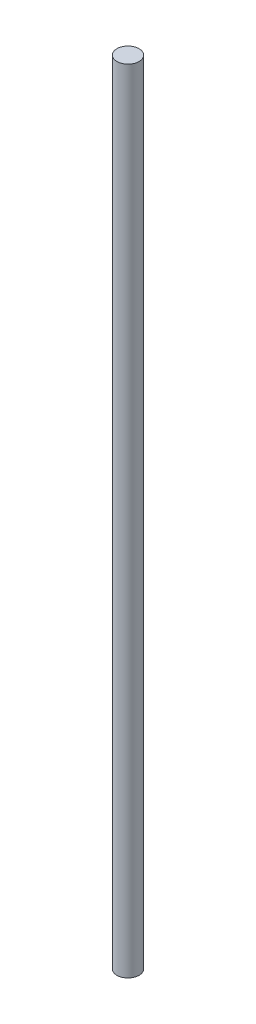
ISO-10303-21;
HEADER;
FILE_DESCRIPTION(('STEP AP214'),'2;1');
FILE_NAME('part.step','',(''),(''),'','','');
FILE_SCHEMA(('AUTOMOTIVE_DESIGN { 1 0 10303 214 1 1 1 1 }'));
ENDSEC;
DATA;
#1=APPLICATION_CONTEXT('core data for automotive mechanical design processes');
#2=APPLICATION_PROTOCOL_DEFINITION('international standard','automotive_design',2000,#1);
#3=PRODUCT_CONTEXT('',#1,'mechanical');
#4=PRODUCT('Part','Part','',(#3));
#5=PRODUCT_RELATED_PRODUCT_CATEGORY('part','',(#4));
#6=PRODUCT_DEFINITION_FORMATION('','',#4);
#7=PRODUCT_DEFINITION_CONTEXT('part definition',#1,'design');
#8=PRODUCT_DEFINITION('design','',#6,#7);
#9=PRODUCT_DEFINITION_SHAPE('','',#8);
#10=(LENGTH_UNIT() NAMED_UNIT(*) SI_UNIT(.MILLI.,.METRE.));
#11=(NAMED_UNIT(*) PLANE_ANGLE_UNIT() SI_UNIT($,.RADIAN.));
#12=(NAMED_UNIT(*) SI_UNIT($,.STERADIAN.) SOLID_ANGLE_UNIT());
#13=UNCERTAINTY_MEASURE_WITH_UNIT(LENGTH_MEASURE(1.E-05),#10,'distance_accuracy_value','');
#14=(GEOMETRIC_REPRESENTATION_CONTEXT(3) GLOBAL_UNCERTAINTY_ASSIGNED_CONTEXT((#13)) GLOBAL_UNIT_ASSIGNED_CONTEXT((#10,
#11,#12)) REPRESENTATION_CONTEXT('',''));
#15=CARTESIAN_POINT('',(0.,0.,0.));
#16=DIRECTION('',(0.,0.,1.));
#17=DIRECTION('',(1.,0.,0.));
#18=AXIS2_PLACEMENT_3D('',#15,#16,#17);
#19=CARTESIAN_POINT('',(0.,285.,0.));
#20=DIRECTION('',(0.,-1.,0.));
#21=DIRECTION('',(0.,0.,-1.));
#22=AXIS2_PLACEMENT_3D('',#19,#20,#21);
#23=CYLINDRICAL_SURFACE('',#22,4.);
#24=CARTESIAN_POINT('',(0.,285.,0.));
#25=DIRECTION('',(0.,1.,0.));
#26=DIRECTION('',(0.,0.,1.));
#27=AXIS2_PLACEMENT_3D('',#24,#25,#26);
#28=CIRCLE('',#27,4.);
#29=CARTESIAN_POINT('',(0.,285.,4.));
#30=VERTEX_POINT('',#29);
#31=EDGE_CURVE('E10',#30,#30,#28,.T.);
#32=ORIENTED_EDGE('',*,*,#31,.F.);
#33=EDGE_LOOP('',(#32));
#34=FACE_BOUND('',#33,.T.);
#35=CARTESIAN_POINT('',(0.,0.,0.));
#36=DIRECTION('',(0.,1.,0.));
#37=DIRECTION('',(0.,0.,1.));
#38=AXIS2_PLACEMENT_3D('',#35,#36,#37);
#39=CIRCLE('',#38,4.);
#40=CARTESIAN_POINT('',(0.,0.,4.));
#41=VERTEX_POINT('',#40);
#42=EDGE_CURVE('E34',#41,#41,#39,.T.);
#43=ORIENTED_EDGE('',*,*,#42,.T.);
#44=EDGE_LOOP('',(#43));
#45=FACE_BOUND('',#44,.T.);
#46=ADVANCED_FACE('F31',(#34,#45),#23,.T.);
#47=CARTESIAN_POINT('',(0.,285.,0.));
#48=DIRECTION('',(0.,1.,0.));
#49=DIRECTION('',(0.,0.,1.));
#50=AXIS2_PLACEMENT_3D('',#47,#48,#49);
#51=PLANE('',#50);
#52=ORIENTED_EDGE('',*,*,#31,.T.);
#53=EDGE_LOOP('',(#52));
#54=FACE_BOUND('',#53,.T.);
#55=ADVANCED_FACE('F46',(#54),#51,.T.);
#56=CARTESIAN_POINT('',(0.,0.,0.));
#57=DIRECTION('',(0.,1.,0.));
#58=DIRECTION('',(0.,0.,1.));
#59=AXIS2_PLACEMENT_3D('',#56,#57,#58);
#60=PLANE('',#59);
#61=ORIENTED_EDGE('',*,*,#42,.F.);
#62=EDGE_LOOP('',(#61));
#63=FACE_BOUND('',#62,.T.);
#64=ADVANCED_FACE('F44',(#63),#60,.F.);
#65=CLOSED_SHELL('',(#46,#55,#64));
#66=MANIFOLD_SOLID_BREP('B2',#65);
#67=ADVANCED_BREP_SHAPE_REPRESENTATION('',(#18,#66),#14);
#68=SHAPE_DEFINITION_REPRESENTATION(#9,#67);
ENDSEC;
END-ISO-10303-21;
